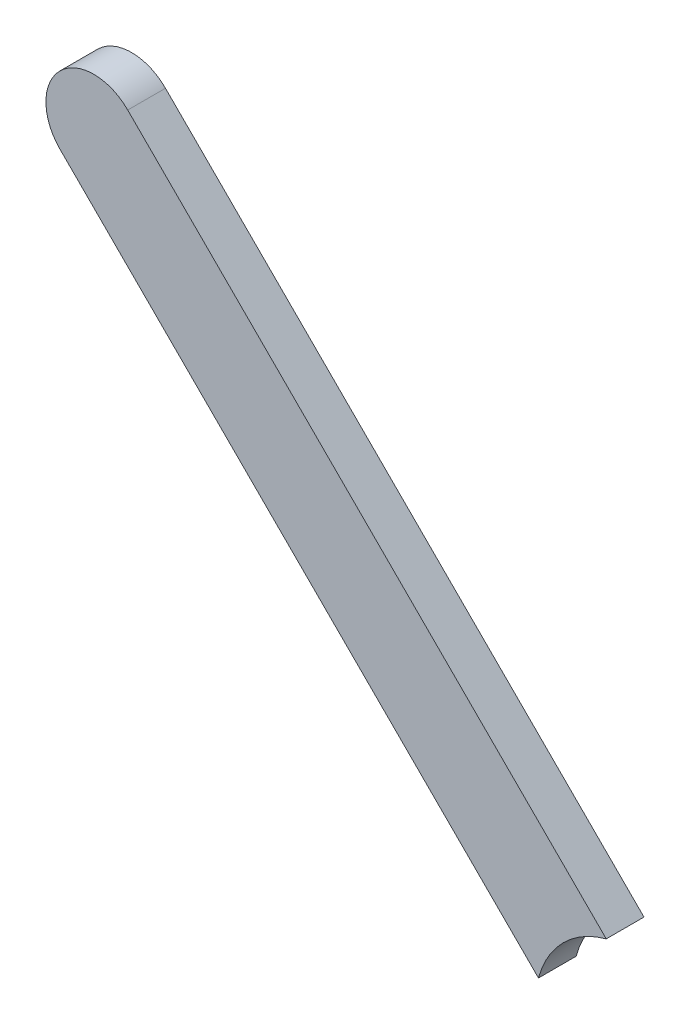
ISO-10303-21;
HEADER;
FILE_DESCRIPTION(('STEP AP214'),'2;1');
FILE_NAME('part.step','',(''),(''),'','','');
FILE_SCHEMA(('AUTOMOTIVE_DESIGN { 1 0 10303 214 1 1 1 1 }'));
ENDSEC;
DATA;
#1=APPLICATION_CONTEXT('core data for automotive mechanical design processes');
#2=APPLICATION_PROTOCOL_DEFINITION('international standard','automotive_design',2000,#1);
#3=PRODUCT_CONTEXT('',#1,'mechanical');
#4=PRODUCT('Part','Part','',(#3));
#5=PRODUCT_RELATED_PRODUCT_CATEGORY('part','',(#4));
#6=PRODUCT_DEFINITION_FORMATION('','',#4);
#7=PRODUCT_DEFINITION_CONTEXT('part definition',#1,'design');
#8=PRODUCT_DEFINITION('design','',#6,#7);
#9=PRODUCT_DEFINITION_SHAPE('','',#8);
#10=(LENGTH_UNIT() NAMED_UNIT(*) SI_UNIT(.MILLI.,.METRE.));
#11=(NAMED_UNIT(*) PLANE_ANGLE_UNIT() SI_UNIT($,.RADIAN.));
#12=(NAMED_UNIT(*) SI_UNIT($,.STERADIAN.) SOLID_ANGLE_UNIT());
#13=UNCERTAINTY_MEASURE_WITH_UNIT(LENGTH_MEASURE(1.E-05),#10,'distance_accuracy_value','');
#14=(GEOMETRIC_REPRESENTATION_CONTEXT(3) GLOBAL_UNCERTAINTY_ASSIGNED_CONTEXT((#13)) GLOBAL_UNIT_ASSIGNED_CONTEXT((#10,
#11,#12)) REPRESENTATION_CONTEXT('',''));
#15=CARTESIAN_POINT('',(0.,0.,0.));
#16=DIRECTION('',(0.,0.,1.));
#17=DIRECTION('',(1.,0.,0.));
#18=AXIS2_PLACEMENT_3D('',#15,#16,#17);
#19=CARTESIAN_POINT('',(149.75390166,66.54888646,0.));
#20=DIRECTION('',(0.707106781186548,0.707106781186548,0.));
#21=DIRECTION('',(0.707106781186548,-0.707106781186548,0.));
#22=AXIS2_PLACEMENT_3D('',#19,#20,#21);
#23=PLANE('',#22);
#24=DIRECTION('',(0.707106781186548,-0.707106781186548,0.));
#25=VECTOR('',#24,1.);
#26=CARTESIAN_POINT('',(149.75390166,66.54888646,0.1999996));
#27=LINE('',#26,#25);
#28=CARTESIAN_POINT('',(149.75390166,66.54888646,0.1999996));
#29=VERTEX_POINT('',#28);
#30=CARTESIAN_POINT('',(152.290309334697,64.0124787853028,0.1999996));
#31=VERTEX_POINT('',#30);
#32=EDGE_CURVE('E11',#29,#31,#27,.T.);
#33=ORIENTED_EDGE('',*,*,#32,.F.);
#34=DIRECTION('',(0.,0.,1.));
#35=VECTOR('',#34,1.);
#36=CARTESIAN_POINT('',(149.75390166,66.54888646,0.));
#37=LINE('',#36,#35);
#38=CARTESIAN_POINT('',(149.75390166,66.54888646,0.));
#39=VERTEX_POINT('',#38);
#40=EDGE_CURVE('E24',#39,#29,#37,.T.);
#41=ORIENTED_EDGE('',*,*,#40,.F.);
#42=DIRECTION('',(0.707106781186548,-0.707106781186548,0.));
#43=VECTOR('',#42,1.);
#44=CARTESIAN_POINT('',(149.75390166,66.54888646,0.));
#45=LINE('',#44,#43);
#46=CARTESIAN_POINT('',(152.290309334697,64.0124787853028,0.));
#47=VERTEX_POINT('',#46);
#48=EDGE_CURVE('E75',#39,#47,#45,.T.);
#49=ORIENTED_EDGE('',*,*,#48,.T.);
#50=DIRECTION('',(0.,0.,1.));
#51=VECTOR('',#50,1.);
#52=CARTESIAN_POINT('',(152.290309334697,64.0124787853028,0.));
#53=LINE('',#52,#51);
#54=EDGE_CURVE('E37',#47,#31,#53,.T.);
#55=ORIENTED_EDGE('',*,*,#54,.T.);
#56=EDGE_LOOP('',(#33,#41,#49,#55));
#57=FACE_BOUND('',#56,.T.);
#58=ADVANCED_FACE('F17',(#57),#23,.F.);
#59=CARTESIAN_POINT('',(152.781,63.881,0.));
#60=DIRECTION('',(0.,0.,-1.));
#61=DIRECTION('',(1.,0.,0.));
#62=AXIS2_PLACEMENT_3D('',#59,#60,#61);
#63=CYLINDRICAL_SURFACE('',#62,0.508);
#64=DIRECTION('',(0.,0.,1.));
#65=VECTOR('',#64,1.);
#66=CARTESIAN_POINT('',(152.649521214697,64.3716906653028,0.));
#67=LINE('',#66,#65);
#68=CARTESIAN_POINT('',(152.649521214697,64.3716906653028,0.));
#69=VERTEX_POINT('',#68);
#70=CARTESIAN_POINT('',(152.649521214697,64.3716906653028,0.1999996));
#71=VERTEX_POINT('',#70);
#72=EDGE_CURVE('E67',#69,#71,#67,.T.);
#73=ORIENTED_EDGE('',*,*,#72,.T.);
#74=CARTESIAN_POINT('',(152.781,63.881,0.1999996));
#75=DIRECTION('',(0.,0.,1.));
#76=DIRECTION('',(1.,0.,0.));
#77=AXIS2_PLACEMENT_3D('',#74,#75,#76);
#78=CIRCLE('',#77,0.508);
#79=EDGE_CURVE('E82',#71,#31,#78,.T.);
#80=ORIENTED_EDGE('',*,*,#79,.T.);
#81=ORIENTED_EDGE('',*,*,#54,.F.);
#82=CARTESIAN_POINT('',(152.781,63.881,0.));
#83=DIRECTION('',(0.,0.,1.));
#84=DIRECTION('',(1.,0.,0.));
#85=AXIS2_PLACEMENT_3D('',#82,#83,#84);
#86=CIRCLE('',#85,0.508);
#87=EDGE_CURVE('E80',#69,#47,#86,.T.);
#88=ORIENTED_EDGE('',*,*,#87,.F.);
#89=EDGE_LOOP('',(#73,#80,#81,#88));
#90=FACE_BOUND('',#89,.T.);
#91=ADVANCED_FACE('F88',(#90),#63,.F.);
#92=CARTESIAN_POINT('',(152.649521214697,64.3716906653028,0.));
#93=DIRECTION('',(-0.707106781186549,-0.707106781186546,0.));
#94=DIRECTION('',(-0.707106781186546,0.707106781186549,0.));
#95=AXIS2_PLACEMENT_3D('',#92,#93,#94);
#96=PLANE('',#95);
#97=DIRECTION('',(-0.707106781186546,0.707106781186549,0.));
#98=VECTOR('',#97,1.);
#99=CARTESIAN_POINT('',(152.96060594,64.06060594,0.1999996));
#100=LINE('',#99,#98);
#101=CARTESIAN_POINT('',(150.11311354,66.90809834,0.1999996));
#102=VERTEX_POINT('',#101);
#103=EDGE_CURVE('E71',#71,#102,#100,.T.);
#104=ORIENTED_EDGE('',*,*,#103,.F.);
#105=ORIENTED_EDGE('',*,*,#72,.F.);
#106=DIRECTION('',(-0.707106781186546,0.707106781186549,0.));
#107=VECTOR('',#106,1.);
#108=CARTESIAN_POINT('',(152.96060594,64.06060594,0.));
#109=LINE('',#108,#107);
#110=CARTESIAN_POINT('',(150.11311354,66.90809834,0.));
#111=VERTEX_POINT('',#110);
#112=EDGE_CURVE('E63',#69,#111,#109,.T.);
#113=ORIENTED_EDGE('',*,*,#112,.T.);
#114=DIRECTION('',(0.,0.,1.));
#115=VECTOR('',#114,1.);
#116=CARTESIAN_POINT('',(150.11311354,66.90809834,0.));
#117=LINE('',#116,#115);
#118=EDGE_CURVE('E53',#111,#102,#117,.T.);
#119=ORIENTED_EDGE('',*,*,#118,.T.);
#120=EDGE_LOOP('',(#104,#105,#113,#119));
#121=FACE_BOUND('',#120,.T.);
#122=ADVANCED_FACE('F66',(#121),#96,.F.);
#123=CARTESIAN_POINT('',(149.9335076,66.7284924,0.));
#124=DIRECTION('',(0.,0.,-1.));
#125=DIRECTION('',(0.707106781186548,0.707106781186548,0.));
#126=AXIS2_PLACEMENT_3D('',#123,#124,#125);
#127=CYLINDRICAL_SURFACE('',#126,0.254001156230774);
#128=CARTESIAN_POINT('',(149.9335076,66.7284924,0.1999996));
#129=DIRECTION('',(0.,0.,1.));
#130=DIRECTION('',(0.707106781186548,0.707106781186548,0.));
#131=AXIS2_PLACEMENT_3D('',#128,#129,#130);
#132=CIRCLE('',#131,0.254001156230774);
#133=EDGE_CURVE('E59',#102,#29,#132,.T.);
#134=ORIENTED_EDGE('',*,*,#133,.F.);
#135=ORIENTED_EDGE('',*,*,#118,.F.);
#136=CARTESIAN_POINT('',(149.9335076,66.7284924,0.));
#137=DIRECTION('',(0.,0.,1.));
#138=DIRECTION('',(0.707106781186548,0.707106781186548,0.));
#139=AXIS2_PLACEMENT_3D('',#136,#137,#138);
#140=CIRCLE('',#139,0.254001156230774);
#141=EDGE_CURVE('E57',#111,#39,#140,.T.);
#142=ORIENTED_EDGE('',*,*,#141,.T.);
#143=ORIENTED_EDGE('',*,*,#40,.T.);
#144=EDGE_LOOP('',(#134,#135,#142,#143));
#145=FACE_BOUND('',#144,.T.);
#146=ADVANCED_FACE('F55',(#145),#127,.T.);
#147=CARTESIAN_POINT('',(149.75390166,66.54888646,0.));
#148=DIRECTION('',(0.,0.,-1.));
#149=DIRECTION('',(-1.,0.,0.));
#150=AXIS2_PLACEMENT_3D('',#147,#148,#149);
#151=PLANE('',#150);
#152=ORIENTED_EDGE('',*,*,#48,.F.);
#153=ORIENTED_EDGE('',*,*,#141,.F.);
#154=ORIENTED_EDGE('',*,*,#112,.F.);
#155=ORIENTED_EDGE('',*,*,#87,.T.);
#156=EDGE_LOOP('',(#152,#153,#154,#155));
#157=FACE_BOUND('',#156,.T.);
#158=ADVANCED_FACE('F74',(#157),#151,.T.);
#159=CARTESIAN_POINT('',(149.75390166,66.54888646,0.1999996));
#160=DIRECTION('',(0.,0.,-1.));
#161=DIRECTION('',(-1.,0.,0.));
#162=AXIS2_PLACEMENT_3D('',#159,#160,#161);
#163=PLANE('',#162);
#164=ORIENTED_EDGE('',*,*,#133,.T.);
#165=ORIENTED_EDGE('',*,*,#32,.T.);
#166=ORIENTED_EDGE('',*,*,#79,.F.);
#167=ORIENTED_EDGE('',*,*,#103,.T.);
#168=EDGE_LOOP('',(#164,#165,#166,#167));
#169=FACE_BOUND('',#168,.T.);
#170=ADVANCED_FACE('F91',(#169),#163,.F.);
#171=CLOSED_SHELL('',(#58,#91,#122,#146,#158,#170));
#172=MANIFOLD_SOLID_BREP('B1',#171);
#173=ADVANCED_BREP_SHAPE_REPRESENTATION('',(#18,#172),#14);
#174=SHAPE_DEFINITION_REPRESENTATION(#9,#173);
ENDSEC;
END-ISO-10303-21;
